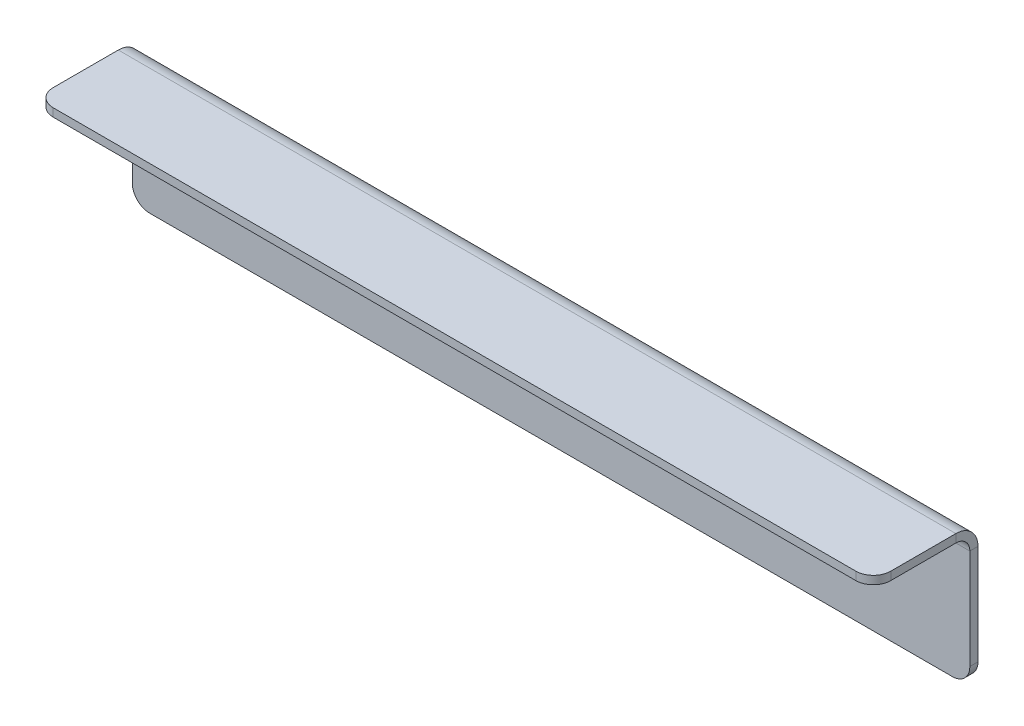
ISO-10303-21;
HEADER;
FILE_DESCRIPTION(('STEP AP214'),'2;1');
FILE_NAME('part.step','',(''),(''),'','','');
FILE_SCHEMA(('AUTOMOTIVE_DESIGN { 1 0 10303 214 1 1 1 1 }'));
ENDSEC;
DATA;
#1=APPLICATION_CONTEXT('core data for automotive mechanical design processes');
#2=APPLICATION_PROTOCOL_DEFINITION('international standard','automotive_design',2000,#1);
#3=PRODUCT_CONTEXT('',#1,'mechanical');
#4=PRODUCT('Part','Part','',(#3));
#5=PRODUCT_RELATED_PRODUCT_CATEGORY('part','',(#4));
#6=PRODUCT_DEFINITION_FORMATION('','',#4);
#7=PRODUCT_DEFINITION_CONTEXT('part definition',#1,'design');
#8=PRODUCT_DEFINITION('design','',#6,#7);
#9=PRODUCT_DEFINITION_SHAPE('','',#8);
#10=(LENGTH_UNIT() NAMED_UNIT(*) SI_UNIT(.MILLI.,.METRE.));
#11=(NAMED_UNIT(*) PLANE_ANGLE_UNIT() SI_UNIT($,.RADIAN.));
#12=(NAMED_UNIT(*) SI_UNIT($,.STERADIAN.) SOLID_ANGLE_UNIT());
#13=UNCERTAINTY_MEASURE_WITH_UNIT(LENGTH_MEASURE(1.E-05),#10,'distance_accuracy_value','');
#14=(GEOMETRIC_REPRESENTATION_CONTEXT(3) GLOBAL_UNCERTAINTY_ASSIGNED_CONTEXT((#13)) GLOBAL_UNIT_ASSIGNED_CONTEXT((#10,
#11,#12)) REPRESENTATION_CONTEXT('',''));
#15=CARTESIAN_POINT('',(0.,0.,0.));
#16=DIRECTION('',(0.,0.,1.));
#17=DIRECTION('',(1.,0.,0.));
#18=AXIS2_PLACEMENT_3D('',#15,#16,#17);
#19=CARTESIAN_POINT('',(-152.4,50.8,2.9718));
#20=DIRECTION('',(0.,0.,-1.));
#21=DIRECTION('',(-1.,0.,0.));
#22=AXIS2_PLACEMENT_3D('',#19,#20,#21);
#23=PLANE('',#22);
#24=CARTESIAN_POINT('',(114.3,19.05,2.97179999999997));
#25=DIRECTION('',(0.,0.,1.));
#26=DIRECTION('',(1.,0.,0.));
#27=AXIS2_PLACEMENT_3D('',#24,#25,#26);
#28=CIRCLE('',#27,2.38125000000001);
#29=CARTESIAN_POINT('',(116.68125,19.05,2.97179999999997));
#30=VERTEX_POINT('',#29);
#31=EDGE_CURVE('E381',#30,#30,#28,.T.);
#32=ORIENTED_EDGE('',*,*,#31,.F.);
#33=EDGE_LOOP('',(#32));
#34=FACE_BOUND('',#33,.T.);
#35=CARTESIAN_POINT('',(-57.15,19.05,2.97179999999997));
#36=DIRECTION('',(0.,0.,1.));
#37=DIRECTION('',(1.,0.,0.));
#38=AXIS2_PLACEMENT_3D('',#35,#36,#37);
#39=CIRCLE('',#38,2.38125);
#40=CARTESIAN_POINT('',(-54.76875,19.05,2.97179999999997));
#41=VERTEX_POINT('',#40);
#42=EDGE_CURVE('E382',#41,#41,#39,.T.);
#43=ORIENTED_EDGE('',*,*,#42,.F.);
#44=EDGE_LOOP('',(#43));
#45=FACE_BOUND('',#44,.T.);
#46=CARTESIAN_POINT('',(57.15,19.05,2.97179999999997));
#47=DIRECTION('',(0.,0.,1.));
#48=DIRECTION('',(1.,0.,0.));
#49=AXIS2_PLACEMENT_3D('',#46,#47,#48);
#50=CIRCLE('',#49,2.38125);
#51=CARTESIAN_POINT('',(59.53125,19.05,2.97179999999997));
#52=VERTEX_POINT('',#51);
#53=EDGE_CURVE('E390',#52,#52,#50,.T.);
#54=ORIENTED_EDGE('',*,*,#53,.F.);
#55=EDGE_LOOP('',(#54));
#56=FACE_BOUND('',#55,.T.);
#57=CARTESIAN_POINT('',(0.,19.05,2.97179999999997));
#58=DIRECTION('',(0.,0.,1.));
#59=DIRECTION('',(1.,0.,0.));
#60=AXIS2_PLACEMENT_3D('',#57,#58,#59);
#61=CIRCLE('',#60,2.38125);
#62=CARTESIAN_POINT('',(2.38125,19.05,2.97179999999997));
#63=VERTEX_POINT('',#62);
#64=EDGE_CURVE('E364',#63,#63,#61,.T.);
#65=ORIENTED_EDGE('',*,*,#64,.F.);
#66=EDGE_LOOP('',(#65));
#67=FACE_BOUND('',#66,.T.);
#68=CARTESIAN_POINT('',(-114.3,19.05,2.97179999999997));
#69=DIRECTION('',(0.,0.,1.));
#70=DIRECTION('',(1.,0.,0.));
#71=AXIS2_PLACEMENT_3D('',#68,#69,#70);
#72=CIRCLE('',#71,2.38125000000001);
#73=CARTESIAN_POINT('',(-111.91875,19.05,2.97179999999997));
#74=VERTEX_POINT('',#73);
#75=EDGE_CURVE('E373',#74,#74,#72,.T.);
#76=ORIENTED_EDGE('',*,*,#75,.F.);
#77=EDGE_LOOP('',(#76));
#78=FACE_BOUND('',#77,.T.);
#79=DIRECTION('',(0.,-1.,0.));
#80=VECTOR('',#79,1.);
#81=CARTESIAN_POINT('',(-152.4,50.8,2.9718));
#82=LINE('',#81,#80);
#83=CARTESIAN_POINT('',(-152.4,42.7482,2.97179999999999));
#84=VERTEX_POINT('',#83);
#85=CARTESIAN_POINT('',(-152.4,6.35,2.9718));
#86=VERTEX_POINT('',#85);
#87=EDGE_CURVE('E243',#84,#86,#82,.T.);
#88=ORIENTED_EDGE('',*,*,#87,.T.);
#89=CARTESIAN_POINT('',(-146.05,6.35,2.9718));
#90=DIRECTION('',(0.,0.,-1.));
#91=DIRECTION('',(-1.,0.,0.));
#92=AXIS2_PLACEMENT_3D('',#89,#90,#91);
#93=CIRCLE('',#92,6.35);
#94=CARTESIAN_POINT('',(-146.05,0.,2.9718));
#95=VERTEX_POINT('',#94);
#96=EDGE_CURVE('E70',#86,#95,#93,.F.);
#97=ORIENTED_EDGE('',*,*,#96,.T.);
#98=DIRECTION('',(1.,0.,0.));
#99=VECTOR('',#98,1.);
#100=CARTESIAN_POINT('',(-152.4,0.,2.9718));
#101=LINE('',#100,#99);
#102=CARTESIAN_POINT('',(146.05,0.,2.97179999999995));
#103=VERTEX_POINT('',#102);
#104=EDGE_CURVE('E234',#95,#103,#101,.T.);
#105=ORIENTED_EDGE('',*,*,#104,.T.);
#106=CARTESIAN_POINT('',(146.05,6.35,2.97179999999995));
#107=DIRECTION('',(0.,0.,-1.));
#108=DIRECTION('',(-1.,0.,0.));
#109=AXIS2_PLACEMENT_3D('',#106,#107,#108);
#110=CIRCLE('',#109,6.35);
#111=CARTESIAN_POINT('',(152.4,6.35,2.97179999999994));
#112=VERTEX_POINT('',#111);
#113=EDGE_CURVE('E77',#103,#112,#110,.F.);
#114=ORIENTED_EDGE('',*,*,#113,.T.);
#115=DIRECTION('',(0.,-1.,0.));
#116=VECTOR('',#115,1.);
#117=CARTESIAN_POINT('',(152.4,50.8,2.97179999999994));
#118=LINE('',#117,#116);
#119=CARTESIAN_POINT('',(152.4,42.7482,2.97179999999994));
#120=VERTEX_POINT('',#119);
#121=EDGE_CURVE('E253',#120,#112,#118,.T.);
#122=ORIENTED_EDGE('',*,*,#121,.F.);
#123=DIRECTION('',(-1.,0.,0.));
#124=VECTOR('',#123,1.);
#125=CARTESIAN_POINT('',(-152.4,42.7482,2.97179999999999));
#126=LINE('',#125,#124);
#127=EDGE_CURVE('E225',#84,#120,#126,.F.);
#128=ORIENTED_EDGE('',*,*,#127,.F.);
#129=EDGE_LOOP('',(#88,#97,#105,#114,#122,#128));
#130=FACE_BOUND('',#129,.T.);
#131=ADVANCED_FACE('F61',(#34,#45,#56,#67,#78,#130),#23,.F.);
#132=CARTESIAN_POINT('',(-152.4,50.8,0.));
#133=DIRECTION('',(0.,0.,-1.));
#134=DIRECTION('',(-1.,0.,0.));
#135=AXIS2_PLACEMENT_3D('',#132,#133,#134);
#136=PLANE('',#135);
#137=CARTESIAN_POINT('',(114.3,19.05,0.));
#138=DIRECTION('',(0.,0.,1.));
#139=DIRECTION('',(1.,0.,0.));
#140=AXIS2_PLACEMENT_3D('',#137,#138,#139);
#141=CIRCLE('',#140,2.38125000000001);
#142=CARTESIAN_POINT('',(116.68125,19.05,0.));
#143=VERTEX_POINT('',#142);
#144=EDGE_CURVE('E215',#143,#143,#141,.T.);
#145=ORIENTED_EDGE('',*,*,#144,.T.);
#146=EDGE_LOOP('',(#145));
#147=FACE_BOUND('',#146,.T.);
#148=CARTESIAN_POINT('',(-57.15,19.05,0.));
#149=DIRECTION('',(0.,0.,1.));
#150=DIRECTION('',(1.,0.,0.));
#151=AXIS2_PLACEMENT_3D('',#148,#149,#150);
#152=CIRCLE('',#151,2.38125);
#153=CARTESIAN_POINT('',(-54.76875,19.05,0.));
#154=VERTEX_POINT('',#153);
#155=EDGE_CURVE('E386',#154,#154,#152,.T.);
#156=ORIENTED_EDGE('',*,*,#155,.T.);
#157=EDGE_LOOP('',(#156));
#158=FACE_BOUND('',#157,.T.);
#159=CARTESIAN_POINT('',(57.15,19.05,0.));
#160=DIRECTION('',(0.,0.,1.));
#161=DIRECTION('',(1.,0.,0.));
#162=AXIS2_PLACEMENT_3D('',#159,#160,#161);
#163=CIRCLE('',#162,2.38125);
#164=CARTESIAN_POINT('',(59.53125,19.05,0.));
#165=VERTEX_POINT('',#164);
#166=EDGE_CURVE('E369',#165,#165,#163,.T.);
#167=ORIENTED_EDGE('',*,*,#166,.T.);
#168=EDGE_LOOP('',(#167));
#169=FACE_BOUND('',#168,.T.);
#170=CARTESIAN_POINT('',(0.,19.05,0.));
#171=DIRECTION('',(0.,0.,1.));
#172=DIRECTION('',(1.,0.,0.));
#173=AXIS2_PLACEMENT_3D('',#170,#171,#172);
#174=CIRCLE('',#173,2.38125);
#175=CARTESIAN_POINT('',(2.38125,19.05,0.));
#176=VERTEX_POINT('',#175);
#177=EDGE_CURVE('E368',#176,#176,#174,.T.);
#178=ORIENTED_EDGE('',*,*,#177,.T.);
#179=EDGE_LOOP('',(#178));
#180=FACE_BOUND('',#179,.T.);
#181=CARTESIAN_POINT('',(-114.3,19.05,0.));
#182=DIRECTION('',(0.,0.,1.));
#183=DIRECTION('',(1.,0.,0.));
#184=AXIS2_PLACEMENT_3D('',#181,#182,#183);
#185=CIRCLE('',#184,2.38125000000001);
#186=CARTESIAN_POINT('',(-111.91875,19.05,0.));
#187=VERTEX_POINT('',#186);
#188=EDGE_CURVE('E377',#187,#187,#185,.T.);
#189=ORIENTED_EDGE('',*,*,#188,.T.);
#190=EDGE_LOOP('',(#189));
#191=FACE_BOUND('',#190,.T.);
#192=DIRECTION('',(1.,0.,0.));
#193=VECTOR('',#192,1.);
#194=CARTESIAN_POINT('',(-152.4,0.,0.));
#195=LINE('',#194,#193);
#196=CARTESIAN_POINT('',(-146.05,0.,0.));
#197=VERTEX_POINT('',#196);
#198=CARTESIAN_POINT('',(146.05,0.,0.));
#199=VERTEX_POINT('',#198);
#200=EDGE_CURVE('E239',#197,#199,#195,.T.);
#201=ORIENTED_EDGE('',*,*,#200,.F.);
#202=CARTESIAN_POINT('',(-146.05,6.35,0.));
#203=DIRECTION('',(0.,0.,-1.));
#204=DIRECTION('',(-1.,0.,0.));
#205=AXIS2_PLACEMENT_3D('',#202,#203,#204);
#206=CIRCLE('',#205,6.35);
#207=CARTESIAN_POINT('',(-152.4,6.35,0.));
#208=VERTEX_POINT('',#207);
#209=EDGE_CURVE('E292',#197,#208,#206,.T.);
#210=ORIENTED_EDGE('',*,*,#209,.T.);
#211=DIRECTION('',(0.,-1.,0.));
#212=VECTOR('',#211,1.);
#213=CARTESIAN_POINT('',(-152.4,50.8,0.));
#214=LINE('',#213,#212);
#215=CARTESIAN_POINT('',(-152.4,42.7482,0.));
#216=VERTEX_POINT('',#215);
#217=EDGE_CURVE('E246',#216,#208,#214,.T.);
#218=ORIENTED_EDGE('',*,*,#217,.F.);
#219=DIRECTION('',(-1.,0.,0.));
#220=VECTOR('',#219,1.);
#221=CARTESIAN_POINT('',(-152.4,42.7482,0.));
#222=LINE('',#221,#220);
#223=CARTESIAN_POINT('',(152.4,42.7482,0.));
#224=VERTEX_POINT('',#223);
#225=EDGE_CURVE('E160',#216,#224,#222,.F.);
#226=ORIENTED_EDGE('',*,*,#225,.T.);
#227=DIRECTION('',(0.,-1.,0.));
#228=VECTOR('',#227,1.);
#229=CARTESIAN_POINT('',(152.4,50.8,0.));
#230=LINE('',#229,#228);
#231=CARTESIAN_POINT('',(152.4,6.35,0.));
#232=VERTEX_POINT('',#231);
#233=EDGE_CURVE('E249',#224,#232,#230,.T.);
#234=ORIENTED_EDGE('',*,*,#233,.T.);
#235=CARTESIAN_POINT('',(146.05,6.35,0.));
#236=DIRECTION('',(0.,0.,-1.));
#237=DIRECTION('',(-1.,0.,0.));
#238=AXIS2_PLACEMENT_3D('',#235,#236,#237);
#239=CIRCLE('',#238,6.35);
#240=EDGE_CURVE('E289',#232,#199,#239,.T.);
#241=ORIENTED_EDGE('',*,*,#240,.T.);
#242=EDGE_LOOP('',(#201,#210,#218,#226,#234,#241));
#243=FACE_BOUND('',#242,.T.);
#244=ADVANCED_FACE('F311',(#147,#158,#169,#180,#191,#243),#136,.T.);
#245=CARTESIAN_POINT('',(-152.4,50.8,2.9718));
#246=DIRECTION('',(-1.,0.,0.));
#247=DIRECTION('',(0.,0.,1.));
#248=AXIS2_PLACEMENT_3D('',#245,#246,#247);
#249=PLANE('',#248);
#250=ORIENTED_EDGE('',*,*,#217,.T.);
#251=DIRECTION('',(0.,0.,-1.));
#252=VECTOR('',#251,1.);
#253=CARTESIAN_POINT('',(-152.4,6.35,2.9718));
#254=LINE('',#253,#252);
#255=EDGE_CURVE('E85',#208,#86,#254,.F.);
#256=ORIENTED_EDGE('',*,*,#255,.T.);
#257=ORIENTED_EDGE('',*,*,#87,.F.);
#258=DIRECTION('',(0.,0.,-1.));
#259=VECTOR('',#258,1.);
#260=CARTESIAN_POINT('',(-152.4,42.7482,2.97179999999999));
#261=LINE('',#260,#259);
#262=EDGE_CURVE('E220',#84,#216,#261,.T.);
#263=ORIENTED_EDGE('',*,*,#262,.T.);
#264=EDGE_LOOP('',(#250,#256,#257,#263));
#265=FACE_BOUND('',#264,.T.);
#266=ADVANCED_FACE('F312',(#265),#249,.T.);
#267=CARTESIAN_POINT('',(152.4,50.8,0.));
#268=DIRECTION('',(1.,0.,0.));
#269=DIRECTION('',(0.,0.,-1.));
#270=AXIS2_PLACEMENT_3D('',#267,#268,#269);
#271=PLANE('',#270);
#272=ORIENTED_EDGE('',*,*,#121,.T.);
#273=DIRECTION('',(0.,0.,1.));
#274=VECTOR('',#273,1.);
#275=CARTESIAN_POINT('',(152.4,6.35,0.));
#276=LINE('',#275,#274);
#277=EDGE_CURVE('E13',#112,#232,#276,.F.);
#278=ORIENTED_EDGE('',*,*,#277,.T.);
#279=ORIENTED_EDGE('',*,*,#233,.F.);
#280=DIRECTION('',(0.,0.,-1.));
#281=VECTOR('',#280,1.);
#282=CARTESIAN_POINT('',(152.4,42.7482,2.97179999999994));
#283=LINE('',#282,#281);
#284=EDGE_CURVE('E230',#120,#224,#283,.T.);
#285=ORIENTED_EDGE('',*,*,#284,.F.);
#286=EDGE_LOOP('',(#272,#278,#279,#285));
#287=FACE_BOUND('',#286,.T.);
#288=ADVANCED_FACE('F320',(#287),#271,.T.);
#289=CARTESIAN_POINT('',(0.,0.,0.));
#290=DIRECTION('',(0.,-1.,0.));
#291=DIRECTION('',(-1.,0.,0.));
#292=AXIS2_PLACEMENT_3D('',#289,#290,#291);
#293=PLANE('',#292);
#294=ORIENTED_EDGE('',*,*,#104,.F.);
#295=DIRECTION('',(0.,0.,-1.));
#296=VECTOR('',#295,1.);
#297=CARTESIAN_POINT('',(-146.05,0.,0.));
#298=LINE('',#297,#296);
#299=EDGE_CURVE('E285',#95,#197,#298,.T.);
#300=ORIENTED_EDGE('',*,*,#299,.T.);
#301=ORIENTED_EDGE('',*,*,#200,.T.);
#302=DIRECTION('',(0.,0.,1.));
#303=VECTOR('',#302,1.);
#304=CARTESIAN_POINT('',(146.05,0.,0.));
#305=LINE('',#304,#303);
#306=EDGE_CURVE('E281',#199,#103,#305,.T.);
#307=ORIENTED_EDGE('',*,*,#306,.T.);
#308=EDGE_LOOP('',(#294,#300,#301,#307));
#309=FACE_BOUND('',#308,.T.);
#310=ADVANCED_FACE('F305',(#309),#293,.T.);
#311=CARTESIAN_POINT('',(152.4,42.7482,8.05179999999994));
#312=DIRECTION('',(1.,0.,0.));
#313=DIRECTION('',(0.,0.,-1.));
#314=AXIS2_PLACEMENT_3D('',#311,#312,#313);
#315=PLANE('',#314);
#316=DIRECTION('',(0.,-1.,0.));
#317=VECTOR('',#316,1.);
#318=CARTESIAN_POINT('',(152.4,50.8,8.05179999999991));
#319=LINE('',#318,#317);
#320=CARTESIAN_POINT('',(152.4,47.8282,8.05179999999992));
#321=VERTEX_POINT('',#320);
#322=CARTESIAN_POINT('',(152.4,50.8,8.05179999999991));
#323=VERTEX_POINT('',#322);
#324=EDGE_CURVE('E211',#321,#323,#319,.F.);
#325=ORIENTED_EDGE('',*,*,#324,.F.);
#326=CARTESIAN_POINT('',(152.4,42.7482,8.05179999999994));
#327=DIRECTION('',(-1.,0.,0.));
#328=DIRECTION('',(0.,0.,1.));
#329=AXIS2_PLACEMENT_3D('',#326,#327,#328);
#330=CIRCLE('',#329,5.08);
#331=EDGE_CURVE('E164',#120,#321,#330,.F.);
#332=ORIENTED_EDGE('',*,*,#331,.F.);
#333=ORIENTED_EDGE('',*,*,#284,.T.);
#334=CARTESIAN_POINT('',(152.4,42.7482,8.05179999999994));
#335=DIRECTION('',(-1.,0.,0.));
#336=DIRECTION('',(0.,0.,1.));
#337=AXIS2_PLACEMENT_3D('',#334,#335,#336);
#338=CIRCLE('',#337,8.0518);
#339=EDGE_CURVE('E218',#224,#323,#338,.F.);
#340=ORIENTED_EDGE('',*,*,#339,.T.);
#341=EDGE_LOOP('',(#325,#332,#333,#340));
#342=FACE_BOUND('',#341,.T.);
#343=ADVANCED_FACE('F443',(#342),#315,.T.);
#344=CARTESIAN_POINT('',(-152.4,42.7482,8.05179999999999));
#345=DIRECTION('',(1.,0.,0.));
#346=DIRECTION('',(0.,0.,-1.));
#347=AXIS2_PLACEMENT_3D('',#344,#345,#346);
#348=PLANE('',#347);
#349=CARTESIAN_POINT('',(-152.4,42.7482,8.05179999999999));
#350=DIRECTION('',(-1.,0.,0.));
#351=DIRECTION('',(0.,0.,1.));
#352=AXIS2_PLACEMENT_3D('',#349,#350,#351);
#353=CIRCLE('',#352,5.08);
#354=CARTESIAN_POINT('',(-152.4,47.8282,8.05179999999997));
#355=VERTEX_POINT('',#354);
#356=EDGE_CURVE('E171',#355,#84,#353,.T.);
#357=ORIENTED_EDGE('',*,*,#356,.F.);
#358=DIRECTION('',(0.,-1.,0.));
#359=VECTOR('',#358,1.);
#360=CARTESIAN_POINT('',(-152.4,47.8282,8.05179999999997));
#361=LINE('',#360,#359);
#362=CARTESIAN_POINT('',(-152.4,50.8,8.05179999999996));
#363=VERTEX_POINT('',#362);
#364=EDGE_CURVE('E168',#355,#363,#361,.F.);
#365=ORIENTED_EDGE('',*,*,#364,.T.);
#366=CARTESIAN_POINT('',(-152.4,42.7482,8.05179999999999));
#367=DIRECTION('',(-1.,0.,0.));
#368=DIRECTION('',(0.,0.,1.));
#369=AXIS2_PLACEMENT_3D('',#366,#367,#368);
#370=CIRCLE('',#369,8.0518);
#371=EDGE_CURVE('E153',#363,#216,#370,.T.);
#372=ORIENTED_EDGE('',*,*,#371,.T.);
#373=ORIENTED_EDGE('',*,*,#262,.F.);
#374=EDGE_LOOP('',(#357,#365,#372,#373));
#375=FACE_BOUND('',#374,.T.);
#376=ADVANCED_FACE('F169',(#375),#348,.F.);
#377=CARTESIAN_POINT('',(-152.4,42.7482,8.05179999999999));
#378=DIRECTION('',(-1.,0.,0.));
#379=DIRECTION('',(0.,1.,0.));
#380=AXIS2_PLACEMENT_3D('',#377,#378,#379);
#381=CYLINDRICAL_SURFACE('',#380,8.0518);
#382=ORIENTED_EDGE('',*,*,#225,.F.);
#383=ORIENTED_EDGE('',*,*,#371,.F.);
#384=DIRECTION('',(-1.,0.,0.));
#385=VECTOR('',#384,1.);
#386=CARTESIAN_POINT('',(152.4,50.8,8.05179999999991));
#387=LINE('',#386,#385);
#388=EDGE_CURVE('E157',#363,#323,#387,.F.);
#389=ORIENTED_EDGE('',*,*,#388,.T.);
#390=ORIENTED_EDGE('',*,*,#339,.F.);
#391=EDGE_LOOP('',(#382,#383,#389,#390));
#392=FACE_BOUND('',#391,.T.);
#393=ADVANCED_FACE('F155',(#392),#381,.T.);
#394=CARTESIAN_POINT('',(-152.4,42.7482,8.05179999999999));
#395=DIRECTION('',(-1.,0.,0.));
#396=DIRECTION('',(0.,1.,0.));
#397=AXIS2_PLACEMENT_3D('',#394,#395,#396);
#398=CYLINDRICAL_SURFACE('',#397,5.08);
#399=ORIENTED_EDGE('',*,*,#127,.T.);
#400=ORIENTED_EDGE('',*,*,#331,.T.);
#401=DIRECTION('',(-1.,0.,0.));
#402=VECTOR('',#401,1.);
#403=CARTESIAN_POINT('',(152.4,47.8282,8.05179999999992));
#404=LINE('',#403,#402);
#405=EDGE_CURVE('E177',#321,#355,#404,.T.);
#406=ORIENTED_EDGE('',*,*,#405,.T.);
#407=ORIENTED_EDGE('',*,*,#356,.T.);
#408=EDGE_LOOP('',(#399,#400,#406,#407));
#409=FACE_BOUND('',#408,.T.);
#410=ADVANCED_FACE('F314',(#409),#398,.F.);
#411=CARTESIAN_POINT('',(-152.4,50.8000000000001,38.1));
#412=DIRECTION('',(1.,0.,0.));
#413=DIRECTION('',(0.,1.,0.));
#414=AXIS2_PLACEMENT_3D('',#411,#412,#413);
#415=PLANE('',#414);
#416=DIRECTION('',(0.,0.,-1.));
#417=VECTOR('',#416,1.);
#418=CARTESIAN_POINT('',(-152.4,47.8282000000001,38.1));
#419=LINE('',#418,#417);
#420=CARTESIAN_POINT('',(-152.4,47.8282000000001,31.75));
#421=VERTEX_POINT('',#420);
#422=EDGE_CURVE('E188',#355,#421,#419,.F.);
#423=ORIENTED_EDGE('',*,*,#422,.T.);
#424=DIRECTION('',(0.,-1.,0.));
#425=VECTOR('',#424,1.);
#426=CARTESIAN_POINT('',(-152.4,50.8000000000001,31.75));
#427=LINE('',#426,#425);
#428=CARTESIAN_POINT('',(-152.4,50.8000000000001,31.75));
#429=VERTEX_POINT('',#428);
#430=EDGE_CURVE('E192',#421,#429,#427,.F.);
#431=ORIENTED_EDGE('',*,*,#430,.T.);
#432=DIRECTION('',(0.,0.,1.));
#433=VECTOR('',#432,1.);
#434=CARTESIAN_POINT('',(-152.4,50.8,-1.9099795137268E-13));
#435=LINE('',#434,#433);
#436=EDGE_CURVE('E183',#363,#429,#435,.T.);
#437=ORIENTED_EDGE('',*,*,#436,.F.);
#438=ORIENTED_EDGE('',*,*,#364,.F.);
#439=EDGE_LOOP('',(#423,#431,#437,#438));
#440=FACE_BOUND('',#439,.T.);
#441=ADVANCED_FACE('F190',(#440),#415,.F.);
#442=CARTESIAN_POINT('',(152.4,50.8,2.97179999999993));
#443=DIRECTION('',(-1.,0.,0.));
#444=DIRECTION('',(0.,-1.,0.));
#445=AXIS2_PLACEMENT_3D('',#442,#443,#444);
#446=PLANE('',#445);
#447=DIRECTION('',(0.,0.,-1.));
#448=VECTOR('',#447,1.);
#449=CARTESIAN_POINT('',(152.4,50.8,-1.9099795137268E-13));
#450=LINE('',#449,#448);
#451=CARTESIAN_POINT('',(152.4,50.8000000000001,31.7499999999999));
#452=VERTEX_POINT('',#451);
#453=EDGE_CURVE('E186',#452,#323,#450,.T.);
#454=ORIENTED_EDGE('',*,*,#453,.F.);
#455=DIRECTION('',(0.,-1.,0.));
#456=VECTOR('',#455,1.);
#457=CARTESIAN_POINT('',(152.4,50.8000000000001,31.7499999999999));
#458=LINE('',#457,#456);
#459=CARTESIAN_POINT('',(152.4,47.8282000000001,31.75));
#460=VERTEX_POINT('',#459);
#461=EDGE_CURVE('E256',#452,#460,#458,.T.);
#462=ORIENTED_EDGE('',*,*,#461,.T.);
#463=DIRECTION('',(0.,0.,1.));
#464=VECTOR('',#463,1.);
#465=CARTESIAN_POINT('',(152.4,47.8282,2.97179999999994));
#466=LINE('',#465,#464);
#467=EDGE_CURVE('E195',#460,#321,#466,.F.);
#468=ORIENTED_EDGE('',*,*,#467,.T.);
#469=ORIENTED_EDGE('',*,*,#324,.T.);
#470=EDGE_LOOP('',(#454,#462,#468,#469));
#471=FACE_BOUND('',#470,.T.);
#472=ADVANCED_FACE('F359',(#471),#446,.F.);
#473=CARTESIAN_POINT('',(0.,50.8,-1.9099795137268E-13));
#474=DIRECTION('',(0.,-1.,0.));
#475=DIRECTION('',(0.,0.,-1.));
#476=AXIS2_PLACEMENT_3D('',#473,#474,#475);
#477=PLANE('',#476);
#478=DIRECTION('',(1.,0.,0.));
#479=VECTOR('',#478,1.);
#480=CARTESIAN_POINT('',(0.,50.8000000000001,38.1));
#481=LINE('',#480,#479);
#482=CARTESIAN_POINT('',(-146.05,50.8000000000001,38.1));
#483=VERTEX_POINT('',#482);
#484=CARTESIAN_POINT('',(146.05,50.8000000000001,38.0999999999999));
#485=VERTEX_POINT('',#484);
#486=EDGE_CURVE('E194',#483,#485,#481,.T.);
#487=ORIENTED_EDGE('',*,*,#486,.T.);
#488=CARTESIAN_POINT('',(146.05,50.8000000000001,31.7499999999999));
#489=DIRECTION('',(0.,-1.,0.));
#490=DIRECTION('',(0.,0.,-1.));
#491=AXIS2_PLACEMENT_3D('',#488,#489,#490);
#492=CIRCLE('',#491,6.35);
#493=EDGE_CURVE('E276',#485,#452,#492,.F.);
#494=ORIENTED_EDGE('',*,*,#493,.T.);
#495=ORIENTED_EDGE('',*,*,#453,.T.);
#496=ORIENTED_EDGE('',*,*,#388,.F.);
#497=ORIENTED_EDGE('',*,*,#436,.T.);
#498=CARTESIAN_POINT('',(-146.05,50.8000000000001,31.75));
#499=DIRECTION('',(0.,-1.,0.));
#500=DIRECTION('',(0.,0.,-1.));
#501=AXIS2_PLACEMENT_3D('',#498,#499,#500);
#502=CIRCLE('',#501,6.35);
#503=EDGE_CURVE('E273',#429,#483,#502,.F.);
#504=ORIENTED_EDGE('',*,*,#503,.T.);
#505=EDGE_LOOP('',(#487,#494,#495,#496,#497,#504));
#506=FACE_BOUND('',#505,.T.);
#507=ADVANCED_FACE('F182',(#506),#477,.F.);
#508=CARTESIAN_POINT('',(0.,47.8282,-1.80621967129906E-13));
#509=DIRECTION('',(0.,-1.,0.));
#510=DIRECTION('',(0.,0.,-1.));
#511=AXIS2_PLACEMENT_3D('',#508,#509,#510);
#512=PLANE('',#511);
#513=ORIENTED_EDGE('',*,*,#467,.F.);
#514=CARTESIAN_POINT('',(146.05,47.8282000000001,31.75));
#515=DIRECTION('',(0.,-1.,0.));
#516=DIRECTION('',(0.,0.,-1.));
#517=AXIS2_PLACEMENT_3D('',#514,#515,#516);
#518=CIRCLE('',#517,6.35);
#519=CARTESIAN_POINT('',(146.05,47.8282000000001,38.1));
#520=VERTEX_POINT('',#519);
#521=EDGE_CURVE('E263',#460,#520,#518,.T.);
#522=ORIENTED_EDGE('',*,*,#521,.T.);
#523=DIRECTION('',(-1.,0.,0.));
#524=VECTOR('',#523,1.);
#525=CARTESIAN_POINT('',(152.4,47.8282000000001,38.1));
#526=LINE('',#525,#524);
#527=CARTESIAN_POINT('',(-146.05,47.8282000000001,38.1));
#528=VERTEX_POINT('',#527);
#529=EDGE_CURVE('E200',#528,#520,#526,.F.);
#530=ORIENTED_EDGE('',*,*,#529,.F.);
#531=CARTESIAN_POINT('',(-146.05,47.8282000000001,31.75));
#532=DIRECTION('',(0.,-1.,0.));
#533=DIRECTION('',(0.,0.,-1.));
#534=AXIS2_PLACEMENT_3D('',#531,#532,#533);
#535=CIRCLE('',#534,6.35);
#536=EDGE_CURVE('E260',#528,#421,#535,.T.);
#537=ORIENTED_EDGE('',*,*,#536,.T.);
#538=ORIENTED_EDGE('',*,*,#422,.F.);
#539=ORIENTED_EDGE('',*,*,#405,.F.);
#540=EDGE_LOOP('',(#513,#522,#530,#537,#538,#539));
#541=FACE_BOUND('',#540,.T.);
#542=ADVANCED_FACE('F429',(#541),#512,.T.);
#543=CARTESIAN_POINT('',(152.4,50.8000000000001,38.0999999999999));
#544=DIRECTION('',(0.,0.,-1.));
#545=DIRECTION('',(0.,1.,0.));
#546=AXIS2_PLACEMENT_3D('',#543,#544,#545);
#547=PLANE('',#546);
#548=ORIENTED_EDGE('',*,*,#529,.T.);
#549=DIRECTION('',(0.,-1.,0.));
#550=VECTOR('',#549,1.);
#551=CARTESIAN_POINT('',(146.05,50.8000000000001,38.0999999999999));
#552=LINE('',#551,#550);
#553=EDGE_CURVE('E270',#520,#485,#552,.F.);
#554=ORIENTED_EDGE('',*,*,#553,.T.);
#555=ORIENTED_EDGE('',*,*,#486,.F.);
#556=DIRECTION('',(0.,-1.,0.));
#557=VECTOR('',#556,1.);
#558=CARTESIAN_POINT('',(-146.05,50.8000000000001,38.1));
#559=LINE('',#558,#557);
#560=EDGE_CURVE('E266',#483,#528,#559,.T.);
#561=ORIENTED_EDGE('',*,*,#560,.T.);
#562=EDGE_LOOP('',(#548,#554,#555,#561));
#563=FACE_BOUND('',#562,.T.);
#564=ADVANCED_FACE('F354',(#563),#547,.F.);
#565=CARTESIAN_POINT('',(-114.3,19.05,0.));
#566=DIRECTION('',(0.,0.,1.));
#567=DIRECTION('',(1.,0.,0.));
#568=AXIS2_PLACEMENT_3D('',#565,#566,#567);
#569=CYLINDRICAL_SURFACE('',#568,2.38125000000001);
#570=ORIENTED_EDGE('',*,*,#188,.F.);
#571=EDGE_LOOP('',(#570));
#572=FACE_BOUND('',#571,.T.);
#573=ORIENTED_EDGE('',*,*,#75,.T.);
#574=EDGE_LOOP('',(#573));
#575=FACE_BOUND('',#574,.T.);
#576=ADVANCED_FACE('F420',(#572,#575),#569,.F.);
#577=CARTESIAN_POINT('',(0.,19.05,0.));
#578=DIRECTION('',(0.,0.,1.));
#579=DIRECTION('',(1.,0.,0.));
#580=AXIS2_PLACEMENT_3D('',#577,#578,#579);
#581=CYLINDRICAL_SURFACE('',#580,2.38125);
#582=ORIENTED_EDGE('',*,*,#177,.F.);
#583=EDGE_LOOP('',(#582));
#584=FACE_BOUND('',#583,.T.);
#585=ORIENTED_EDGE('',*,*,#64,.T.);
#586=EDGE_LOOP('',(#585));
#587=FACE_BOUND('',#586,.T.);
#588=ADVANCED_FACE('F417',(#584,#587),#581,.F.);
#589=CARTESIAN_POINT('',(57.15,19.05,0.));
#590=DIRECTION('',(0.,0.,1.));
#591=DIRECTION('',(1.,0.,0.));
#592=AXIS2_PLACEMENT_3D('',#589,#590,#591);
#593=CYLINDRICAL_SURFACE('',#592,2.38125);
#594=ORIENTED_EDGE('',*,*,#166,.F.);
#595=EDGE_LOOP('',(#594));
#596=FACE_BOUND('',#595,.T.);
#597=ORIENTED_EDGE('',*,*,#53,.T.);
#598=EDGE_LOOP('',(#597));
#599=FACE_BOUND('',#598,.T.);
#600=ADVANCED_FACE('F412',(#596,#599),#593,.F.);
#601=CARTESIAN_POINT('',(-57.15,19.05,0.));
#602=DIRECTION('',(0.,0.,1.));
#603=DIRECTION('',(1.,0.,0.));
#604=AXIS2_PLACEMENT_3D('',#601,#602,#603);
#605=CYLINDRICAL_SURFACE('',#604,2.38125);
#606=ORIENTED_EDGE('',*,*,#155,.F.);
#607=EDGE_LOOP('',(#606));
#608=FACE_BOUND('',#607,.T.);
#609=ORIENTED_EDGE('',*,*,#42,.T.);
#610=EDGE_LOOP('',(#609));
#611=FACE_BOUND('',#610,.T.);
#612=ADVANCED_FACE('F407',(#608,#611),#605,.F.);
#613=CARTESIAN_POINT('',(114.3,19.05,0.));
#614=DIRECTION('',(0.,0.,1.));
#615=DIRECTION('',(1.,0.,0.));
#616=AXIS2_PLACEMENT_3D('',#613,#614,#615);
#617=CYLINDRICAL_SURFACE('',#616,2.38125000000001);
#618=ORIENTED_EDGE('',*,*,#144,.F.);
#619=EDGE_LOOP('',(#618));
#620=FACE_BOUND('',#619,.T.);
#621=ORIENTED_EDGE('',*,*,#31,.T.);
#622=EDGE_LOOP('',(#621));
#623=FACE_BOUND('',#622,.T.);
#624=ADVANCED_FACE('F344',(#620,#623),#617,.F.);
#625=CARTESIAN_POINT('',(146.05,50.8000000000001,31.7499999999999));
#626=DIRECTION('',(0.,-1.,0.));
#627=DIRECTION('',(0.,0.,-1.));
#628=AXIS2_PLACEMENT_3D('',#625,#626,#627);
#629=CYLINDRICAL_SURFACE('',#628,6.35);
#630=ORIENTED_EDGE('',*,*,#493,.F.);
#631=ORIENTED_EDGE('',*,*,#553,.F.);
#632=ORIENTED_EDGE('',*,*,#521,.F.);
#633=ORIENTED_EDGE('',*,*,#461,.F.);
#634=EDGE_LOOP('',(#630,#631,#632,#633));
#635=FACE_BOUND('',#634,.T.);
#636=ADVANCED_FACE('F341',(#635),#629,.T.);
#637=CARTESIAN_POINT('',(-146.05,50.8000000000001,31.75));
#638=DIRECTION('',(0.,-1.,0.));
#639=DIRECTION('',(0.,0.,-1.));
#640=AXIS2_PLACEMENT_3D('',#637,#638,#639);
#641=CYLINDRICAL_SURFACE('',#640,6.35);
#642=ORIENTED_EDGE('',*,*,#503,.F.);
#643=ORIENTED_EDGE('',*,*,#430,.F.);
#644=ORIENTED_EDGE('',*,*,#536,.F.);
#645=ORIENTED_EDGE('',*,*,#560,.F.);
#646=EDGE_LOOP('',(#642,#643,#644,#645));
#647=FACE_BOUND('',#646,.T.);
#648=ADVANCED_FACE('F328',(#647),#641,.T.);
#649=CARTESIAN_POINT('',(-146.05,6.35,0.));
#650=DIRECTION('',(0.,0.,-1.));
#651=DIRECTION('',(-1.,0.,0.));
#652=AXIS2_PLACEMENT_3D('',#649,#650,#651);
#653=CYLINDRICAL_SURFACE('',#652,6.35);
#654=ORIENTED_EDGE('',*,*,#96,.F.);
#655=ORIENTED_EDGE('',*,*,#255,.F.);
#656=ORIENTED_EDGE('',*,*,#209,.F.);
#657=ORIENTED_EDGE('',*,*,#299,.F.);
#658=EDGE_LOOP('',(#654,#655,#656,#657));
#659=FACE_BOUND('',#658,.T.);
#660=ADVANCED_FACE('F308',(#659),#653,.T.);
#661=CARTESIAN_POINT('',(146.05,6.35,0.));
#662=DIRECTION('',(0.,0.,1.));
#663=DIRECTION('',(1.,0.,0.));
#664=AXIS2_PLACEMENT_3D('',#661,#662,#663);
#665=CYLINDRICAL_SURFACE('',#664,6.35);
#666=ORIENTED_EDGE('',*,*,#240,.F.);
#667=ORIENTED_EDGE('',*,*,#277,.F.);
#668=ORIENTED_EDGE('',*,*,#113,.F.);
#669=ORIENTED_EDGE('',*,*,#306,.F.);
#670=EDGE_LOOP('',(#666,#667,#668,#669));
#671=FACE_BOUND('',#670,.T.);
#672=ADVANCED_FACE('F63',(#671),#665,.T.);
#673=CLOSED_SHELL('',(#131,#244,#266,#288,#310,#343,#376,#393,#410,#441,#472,#507,#542,#564,
#576,#588,#600,#612,#624,#636,#648,#660,#672));
#674=MANIFOLD_SOLID_BREP('B2',#673);
#675=ADVANCED_BREP_SHAPE_REPRESENTATION('',(#18,#674),#14);
#676=SHAPE_DEFINITION_REPRESENTATION(#9,#675);
ENDSEC;
END-ISO-10303-21;
